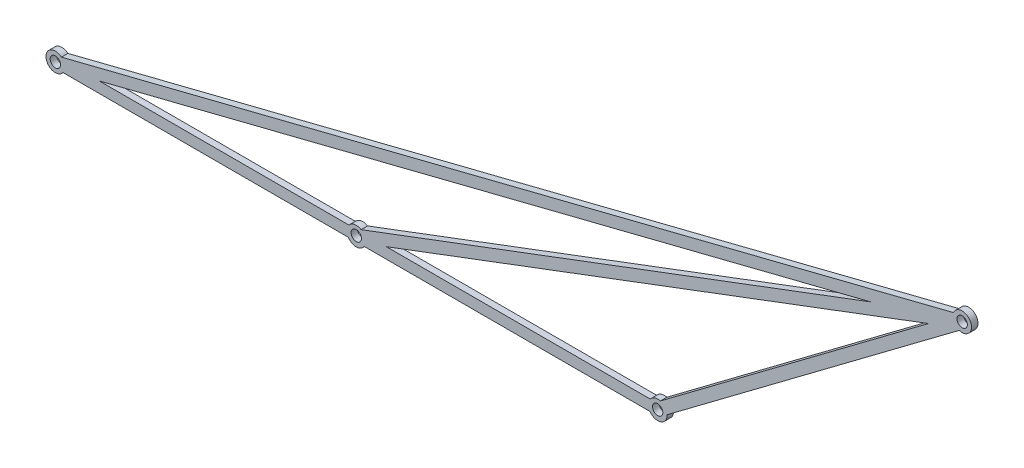
ISO-10303-21;
HEADER;
FILE_DESCRIPTION(('STEP AP214'),'2;1');
FILE_NAME('part.step','',(''),(''),'','','');
FILE_SCHEMA(('AUTOMOTIVE_DESIGN { 1 0 10303 214 1 1 1 1 }'));
ENDSEC;
DATA;
#1=APPLICATION_CONTEXT('core data for automotive mechanical design processes');
#2=APPLICATION_PROTOCOL_DEFINITION('international standard','automotive_design',2000,#1);
#3=PRODUCT_CONTEXT('',#1,'mechanical');
#4=PRODUCT('Part','Part','',(#3));
#5=PRODUCT_RELATED_PRODUCT_CATEGORY('part','',(#4));
#6=PRODUCT_DEFINITION_FORMATION('','',#4);
#7=PRODUCT_DEFINITION_CONTEXT('part definition',#1,'design');
#8=PRODUCT_DEFINITION('design','',#6,#7);
#9=PRODUCT_DEFINITION_SHAPE('','',#8);
#10=(LENGTH_UNIT() NAMED_UNIT(*) SI_UNIT(.MILLI.,.METRE.));
#11=(NAMED_UNIT(*) PLANE_ANGLE_UNIT() SI_UNIT($,.RADIAN.));
#12=(NAMED_UNIT(*) SI_UNIT($,.STERADIAN.) SOLID_ANGLE_UNIT());
#13=UNCERTAINTY_MEASURE_WITH_UNIT(LENGTH_MEASURE(1.E-05),#10,'distance_accuracy_value','');
#14=(GEOMETRIC_REPRESENTATION_CONTEXT(3) GLOBAL_UNCERTAINTY_ASSIGNED_CONTEXT((#13)) GLOBAL_UNIT_ASSIGNED_CONTEXT((#10,
#11,#12)) REPRESENTATION_CONTEXT('',''));
#15=CARTESIAN_POINT('',(0.,0.,0.));
#16=DIRECTION('',(0.,0.,1.));
#17=DIRECTION('',(1.,0.,0.));
#18=AXIS2_PLACEMENT_3D('',#15,#16,#17);
#19=CARTESIAN_POINT('',(399.72304446573,299.748851909776,8.5));
#20=DIRECTION('',(0.,0.,-1.));
#21=DIRECTION('',(-1.,0.,0.));
#22=AXIS2_PLACEMENT_3D('',#19,#20,#21);
#23=CYLINDRICAL_SURFACE('',#22,12.2928402072178);
#24=CARTESIAN_POINT('',(399.72304446573,299.748851909776,0.));
#25=DIRECTION('',(0.,0.,1.));
#26=DIRECTION('',(1.,0.,0.));
#27=AXIS2_PLACEMENT_3D('',#24,#25,#26);
#28=CIRCLE('',#27,12.2928402072178);
#29=CARTESIAN_POINT('',(395.972037606743,288.042278205057,0.));
#30=VERTEX_POINT('',#29);
#31=CARTESIAN_POINT('',(388.360524277615,304.440019710533,0.));
#32=VERTEX_POINT('',#31);
#33=EDGE_CURVE('E612',#30,#32,#28,.T.);
#34=ORIENTED_EDGE('',*,*,#33,.T.);
#35=DIRECTION('',(0.,0.,-1.));
#36=VECTOR('',#35,1.);
#37=CARTESIAN_POINT('',(388.360524277615,304.440019710533,8.5));
#38=LINE('',#37,#36);
#39=CARTESIAN_POINT('',(388.360524277615,304.440019710533,8.5));
#40=VERTEX_POINT('',#39);
#41=EDGE_CURVE('E427',#40,#32,#38,.T.);
#42=ORIENTED_EDGE('',*,*,#41,.F.);
#43=CARTESIAN_POINT('',(399.72304446573,299.748851909776,8.5));
#44=DIRECTION('',(0.,0.,1.));
#45=DIRECTION('',(1.,0.,0.));
#46=AXIS2_PLACEMENT_3D('',#43,#44,#45);
#47=CIRCLE('',#46,12.2928402072178);
#48=CARTESIAN_POINT('',(395.972037606743,288.042278205057,8.5));
#49=VERTEX_POINT('',#48);
#50=EDGE_CURVE('E667',#49,#40,#47,.T.);
#51=ORIENTED_EDGE('',*,*,#50,.F.);
#52=DIRECTION('',(0.,0.,-1.));
#53=VECTOR('',#52,1.);
#54=CARTESIAN_POINT('',(395.972037606743,288.042278205057,8.5));
#55=LINE('',#54,#53);
#56=EDGE_CURVE('E12',#49,#30,#55,.T.);
#57=ORIENTED_EDGE('',*,*,#56,.T.);
#58=EDGE_LOOP('',(#34,#42,#51,#57));
#59=FACE_BOUND('',#58,.T.);
#60=ADVANCED_FACE('F417',(#59),#23,.T.);
#61=CARTESIAN_POINT('',(0.,0.,0.));
#62=DIRECTION('',(0.,0.,1.));
#63=DIRECTION('',(1.,0.,0.));
#64=AXIS2_PLACEMENT_3D('',#61,#62,#63);
#65=PLANE('',#64);
#66=CARTESIAN_POINT('',(399.72304446573,299.748851909776,0.));
#67=DIRECTION('',(0.,0.,1.));
#68=DIRECTION('',(1.,0.,0.));
#69=AXIS2_PLACEMENT_3D('',#66,#67,#68);
#70=CIRCLE('',#69,6.81500000000003);
#71=CARTESIAN_POINT('',(406.53804446573,299.748851909776,0.));
#72=VERTEX_POINT('',#71);
#73=EDGE_CURVE('E581',#72,#72,#70,.T.);
#74=ORIENTED_EDGE('',*,*,#73,.T.);
#75=EDGE_LOOP('',(#74));
#76=FACE_BOUND('',#75,.T.);
#77=CARTESIAN_POINT('',(-395.609498980774,0.,0.));
#78=DIRECTION('',(0.,0.,1.));
#79=DIRECTION('',(1.,0.,0.));
#80=AXIS2_PLACEMENT_3D('',#77,#78,#79);
#81=CIRCLE('',#80,6.81500000000003);
#82=CARTESIAN_POINT('',(-388.794498980774,0.,0.));
#83=VERTEX_POINT('',#82);
#84=EDGE_CURVE('E683',#83,#83,#81,.T.);
#85=ORIENTED_EDGE('',*,*,#84,.T.);
#86=EDGE_LOOP('',(#85));
#87=FACE_BOUND('',#86,.T.);
#88=CARTESIAN_POINT('',(0.,0.,0.));
#89=DIRECTION('',(0.,0.,1.));
#90=DIRECTION('',(1.,0.,0.));
#91=AXIS2_PLACEMENT_3D('',#88,#89,#90);
#92=CIRCLE('',#91,6.815);
#93=CARTESIAN_POINT('',(6.815,0.,0.));
#94=VERTEX_POINT('',#93);
#95=EDGE_CURVE('E677',#94,#94,#92,.T.);
#96=ORIENTED_EDGE('',*,*,#95,.T.);
#97=EDGE_LOOP('',(#96));
#98=FACE_BOUND('',#97,.T.);
#99=CARTESIAN_POINT('',(-790.597372058686,-1.45230381165897E-13,0.));
#100=DIRECTION('',(0.,0.,1.));
#101=DIRECTION('',(1.,0.,0.));
#102=AXIS2_PLACEMENT_3D('',#99,#100,#101);
#103=CIRCLE('',#102,6.81500000000003);
#104=CARTESIAN_POINT('',(-783.782372058686,-1.45230381165897E-13,0.));
#105=VERTEX_POINT('',#104);
#106=EDGE_CURVE('E671',#105,#105,#103,.T.);
#107=ORIENTED_EDGE('',*,*,#106,.T.);
#108=EDGE_LOOP('',(#107));
#109=FACE_BOUND('',#108,.T.);
#110=DIRECTION('',(0.8,0.6,0.));
#111=VECTOR('',#110,1.);
#112=CARTESIAN_POINT('',(4.28963999999937,-5.71952000000044,0.));
#113=LINE('',#112,#111);
#114=CARTESIAN_POINT('',(12.4331257799266,0.388094334944971,0.));
#115=VERTEX_POINT('',#114);
#116=EDGE_CURVE('E564',#115,#30,#113,.T.);
#117=ORIENTED_EDGE('',*,*,#116,.F.);
#118=CARTESIAN_POINT('',(0.156250041431716,-0.238198297733638,0.));
#119=DIRECTION('',(0.,0.,1.));
#120=DIRECTION('',(1.,0.,0.));
#121=AXIS2_PLACEMENT_3D('',#118,#119,#120);
#122=CIRCLE('',#121,12.2928402072178);
#123=CARTESIAN_POINT('',(-10.0098313762425,-7.14940000000005,0.));
#124=VERTEX_POINT('',#123);
#125=EDGE_CURVE('E577',#124,#115,#122,.T.);
#126=ORIENTED_EDGE('',*,*,#125,.F.);
#127=DIRECTION('',(-1.,0.,0.));
#128=VECTOR('',#127,1.);
#129=CARTESIAN_POINT('',(0.,-7.14940000000005,0.));
#130=LINE('',#129,#128);
#131=CARTESIAN_POINT('',(-385.280698127999,-7.14940000000001,0.));
#132=VERTEX_POINT('',#131);
#133=EDGE_CURVE('E629',#124,#132,#130,.T.);
#134=ORIENTED_EDGE('',*,*,#133,.T.);
#135=CARTESIAN_POINT('',(-395.672766052159,-0.582905911078374,0.));
#136=DIRECTION('',(0.,0.,1.));
#137=DIRECTION('',(1.,0.,0.));
#138=AXIS2_PLACEMENT_3D('',#135,#136,#137);
#139=CIRCLE('',#138,12.2928402072178);
#140=CARTESIAN_POINT('',(-406.064833976318,-7.1494,0.));
#141=VERTEX_POINT('',#140);
#142=EDGE_CURVE('E553',#141,#132,#139,.T.);
#143=ORIENTED_EDGE('',*,*,#142,.F.);
#144=CARTESIAN_POINT('',(-780.597372058677,-7.14939999999996,0.));
#145=VERTEX_POINT('',#144);
#146=EDGE_CURVE('E636',#141,#145,#130,.T.);
#147=ORIENTED_EDGE('',*,*,#146,.T.);
#148=CARTESIAN_POINT('',(-790.597372058686,-1.45230381165897E-13,0.));
#149=DIRECTION('',(0.,0.,1.));
#150=DIRECTION('',(1.,0.,0.));
#151=AXIS2_PLACEMENT_3D('',#148,#149,#150);
#152=CIRCLE('',#151,12.2928402072178);
#153=CARTESIAN_POINT('',(-782.647332163134,9.37607519270833,0.));
#154=VERTEX_POINT('',#153);
#155=EDGE_CURVE('E580',#154,#145,#152,.T.);
#156=ORIENTED_EDGE('',*,*,#155,.F.);
#157=DIRECTION('',(0.969690354066138,0.244337097533485,0.));
#158=VECTOR('',#157,1.);
#159=CARTESIAN_POINT('',(-782.647332163134,9.37607519270833,0.));
#160=LINE('',#159,#158);
#161=EDGE_CURVE('E606',#154,#32,#160,.T.);
#162=ORIENTED_EDGE('',*,*,#161,.T.);
#163=ORIENTED_EDGE('',*,*,#33,.F.);
#164=EDGE_LOOP('',(#117,#126,#134,#143,#147,#156,#162,#163));
#165=FACE_BOUND('',#164,.T.);
#166=CARTESIAN_POINT('',(3.52842507334304,11.5830688050073,0.));
#167=VERTEX_POINT('',#166);
#168=CARTESIAN_POINT('',(-9.66909024537339,7.14939999999995,0.));
#169=VERTEX_POINT('',#168);
#170=EDGE_CURVE('E575',#167,#169,#122,.T.);
#171=ORIENTED_EDGE('',*,*,#170,.F.);
#172=DIRECTION('',(0.8,0.6,0.));
#173=VECTOR('',#172,1.);
#174=CARTESIAN_POINT('',(-4.28964000000063,5.71951999999956,0.));
#175=LINE('',#174,#173);
#176=CARTESIAN_POINT('',(355.529405996581,275.583804497435,0.));
#177=VERTEX_POINT('',#176);
#178=EDGE_CURVE('E540',#167,#177,#175,.T.);
#179=ORIENTED_EDGE('',*,*,#178,.T.);
#180=DIRECTION('',(-0.935645512975698,-0.352941176470588,0.));
#181=VECTOR('',#180,1.);
#182=CARTESIAN_POINT('',(402.52331764706,293.310695969532,0.));
#183=LINE('',#182,#181);
#184=CARTESIAN_POINT('',(-356.089024609682,7.14940000000004,0.));
#185=VERTEX_POINT('',#184);
#186=EDGE_CURVE('E584',#177,#185,#183,.T.);
#187=ORIENTED_EDGE('',*,*,#186,.T.);
#188=DIRECTION('',(-1.,0.,0.));
#189=VECTOR('',#188,1.);
#190=CARTESIAN_POINT('',(0.,7.14939999999994,0.));
#191=LINE('',#190,#189);
#192=EDGE_CURVE('E635',#169,#185,#191,.T.);
#193=ORIENTED_EDGE('',*,*,#192,.F.);
#194=EDGE_LOOP('',(#171,#179,#187,#193));
#195=FACE_BOUND('',#194,.T.);
#196=CARTESIAN_POINT('',(-389.274490600557,9.91356928803593,0.));
#197=VERTEX_POINT('',#196);
#198=CARTESIAN_POINT('',(-405.229196644053,7.14939999999999,0.));
#199=VERTEX_POINT('',#198);
#200=EDGE_CURVE('E572',#197,#199,#139,.T.);
#201=ORIENTED_EDGE('',*,*,#200,.F.);
#202=DIRECTION('',(-0.935645512975698,-0.352941176470588,0.));
#203=VECTOR('',#202,1.);
#204=CARTESIAN_POINT('',(397.476682352942,306.689304030469,0.));
#205=LINE('',#204,#203);
#206=CARTESIAN_POINT('',(280.120400530507,262.420546687856,0.));
#207=VERTEX_POINT('',#206);
#208=EDGE_CURVE('E640',#207,#197,#205,.T.);
#209=ORIENTED_EDGE('',*,*,#208,.F.);
#210=DIRECTION('',(0.969690354066138,0.244337097533485,0.));
#211=VECTOR('',#210,1.);
#212=CARTESIAN_POINT('',(-779.153604872923,-4.48933324201257,0.));
#213=LINE('',#212,#211);
#214=CARTESIAN_POINT('',(-732.963454166145,7.14939999999995,0.));
#215=VERTEX_POINT('',#214);
#216=EDGE_CURVE('E623',#215,#207,#213,.T.);
#217=ORIENTED_EDGE('',*,*,#216,.F.);
#218=EDGE_CURVE('E588',#199,#215,#191,.T.);
#219=ORIENTED_EDGE('',*,*,#218,.F.);
#220=EDGE_LOOP('',(#201,#209,#217,#219));
#221=FACE_BOUND('',#220,.T.);
#222=ADVANCED_FACE('F653',(#76,#87,#98,#109,#165,#195,#221),#65,.F.);
#223=CARTESIAN_POINT('',(0.,0.,8.5));
#224=DIRECTION('',(0.,0.,1.));
#225=DIRECTION('',(1.,0.,0.));
#226=AXIS2_PLACEMENT_3D('',#223,#224,#225);
#227=PLANE('',#226);
#228=CARTESIAN_POINT('',(399.72304446573,299.748851909776,8.5));
#229=DIRECTION('',(0.,0.,1.));
#230=DIRECTION('',(1.,0.,0.));
#231=AXIS2_PLACEMENT_3D('',#228,#229,#230);
#232=CIRCLE('',#231,6.81500000000003);
#233=CARTESIAN_POINT('',(406.53804446573,299.748851909776,8.5));
#234=VERTEX_POINT('',#233);
#235=EDGE_CURVE('E689',#234,#234,#232,.T.);
#236=ORIENTED_EDGE('',*,*,#235,.F.);
#237=EDGE_LOOP('',(#236));
#238=FACE_BOUND('',#237,.T.);
#239=CARTESIAN_POINT('',(-395.609498980774,0.,8.5));
#240=DIRECTION('',(0.,0.,1.));
#241=DIRECTION('',(1.,0.,0.));
#242=AXIS2_PLACEMENT_3D('',#239,#240,#241);
#243=CIRCLE('',#242,6.81500000000003);
#244=CARTESIAN_POINT('',(-388.794498980774,0.,8.5));
#245=VERTEX_POINT('',#244);
#246=EDGE_CURVE('E686',#245,#245,#243,.T.);
#247=ORIENTED_EDGE('',*,*,#246,.F.);
#248=EDGE_LOOP('',(#247));
#249=FACE_BOUND('',#248,.T.);
#250=CARTESIAN_POINT('',(0.,0.,8.5));
#251=DIRECTION('',(0.,0.,1.));
#252=DIRECTION('',(1.,0.,0.));
#253=AXIS2_PLACEMENT_3D('',#250,#251,#252);
#254=CIRCLE('',#253,6.815);
#255=CARTESIAN_POINT('',(6.815,0.,8.5));
#256=VERTEX_POINT('',#255);
#257=EDGE_CURVE('E680',#256,#256,#254,.T.);
#258=ORIENTED_EDGE('',*,*,#257,.F.);
#259=EDGE_LOOP('',(#258));
#260=FACE_BOUND('',#259,.T.);
#261=CARTESIAN_POINT('',(-790.597372058686,-1.45230381165897E-13,8.5));
#262=DIRECTION('',(0.,0.,1.));
#263=DIRECTION('',(1.,0.,0.));
#264=AXIS2_PLACEMENT_3D('',#261,#262,#263);
#265=CIRCLE('',#264,6.81500000000003);
#266=CARTESIAN_POINT('',(-783.782372058686,-1.45230381165897E-13,8.5));
#267=VERTEX_POINT('',#266);
#268=EDGE_CURVE('E674',#267,#267,#265,.T.);
#269=ORIENTED_EDGE('',*,*,#268,.F.);
#270=EDGE_LOOP('',(#269));
#271=FACE_BOUND('',#270,.T.);
#272=CARTESIAN_POINT('',(0.156250041431716,-0.238198297733638,8.5));
#273=DIRECTION('',(0.,0.,1.));
#274=DIRECTION('',(1.,0.,0.));
#275=AXIS2_PLACEMENT_3D('',#272,#273,#274);
#276=CIRCLE('',#275,12.2928402072178);
#277=CARTESIAN_POINT('',(-10.0098313762425,-7.14940000000005,8.5));
#278=VERTEX_POINT('',#277);
#279=CARTESIAN_POINT('',(12.4331257799266,0.388094334944971,8.5));
#280=VERTEX_POINT('',#279);
#281=EDGE_CURVE('E527',#278,#280,#276,.T.);
#282=ORIENTED_EDGE('',*,*,#281,.T.);
#283=DIRECTION('',(0.8,0.6,0.));
#284=VECTOR('',#283,1.);
#285=CARTESIAN_POINT('',(4.28963999999937,-5.71952000000044,8.5));
#286=LINE('',#285,#284);
#287=EDGE_CURVE('E559',#280,#49,#286,.T.);
#288=ORIENTED_EDGE('',*,*,#287,.T.);
#289=ORIENTED_EDGE('',*,*,#50,.T.);
#290=DIRECTION('',(0.969690354066138,0.244337097533485,0.));
#291=VECTOR('',#290,1.);
#292=CARTESIAN_POINT('',(-782.647332163134,9.37607519270833,8.5));
#293=LINE('',#292,#291);
#294=CARTESIAN_POINT('',(-782.647332163134,9.37607519270833,8.5));
#295=VERTEX_POINT('',#294);
#296=EDGE_CURVE('E619',#295,#40,#293,.T.);
#297=ORIENTED_EDGE('',*,*,#296,.F.);
#298=CARTESIAN_POINT('',(-790.597372058686,-1.45230381165897E-13,8.5));
#299=DIRECTION('',(0.,0.,1.));
#300=DIRECTION('',(1.,0.,0.));
#301=AXIS2_PLACEMENT_3D('',#298,#299,#300);
#302=CIRCLE('',#301,12.2928402072178);
#303=CARTESIAN_POINT('',(-780.597372058677,-7.14939999999996,8.5));
#304=VERTEX_POINT('',#303);
#305=EDGE_CURVE('E578',#295,#304,#302,.T.);
#306=ORIENTED_EDGE('',*,*,#305,.T.);
#307=DIRECTION('',(-1.,0.,0.));
#308=VECTOR('',#307,1.);
#309=CARTESIAN_POINT('',(0.,-7.14940000000005,8.5));
#310=LINE('',#309,#308);
#311=CARTESIAN_POINT('',(-406.064833976318,-7.1494,8.5));
#312=VERTEX_POINT('',#311);
#313=EDGE_CURVE('E630',#312,#304,#310,.T.);
#314=ORIENTED_EDGE('',*,*,#313,.F.);
#315=CARTESIAN_POINT('',(-395.672766052159,-0.582905911078374,8.5));
#316=DIRECTION('',(0.,0.,1.));
#317=DIRECTION('',(1.,0.,0.));
#318=AXIS2_PLACEMENT_3D('',#315,#316,#317);
#319=CIRCLE('',#318,12.2928402072178);
#320=CARTESIAN_POINT('',(-385.280698127999,-7.14940000000001,8.5));
#321=VERTEX_POINT('',#320);
#322=EDGE_CURVE('E571',#312,#321,#319,.T.);
#323=ORIENTED_EDGE('',*,*,#322,.T.);
#324=EDGE_CURVE('E596',#278,#321,#310,.T.);
#325=ORIENTED_EDGE('',*,*,#324,.F.);
#326=EDGE_LOOP('',(#282,#288,#289,#297,#306,#314,#323,#325));
#327=FACE_BOUND('',#326,.T.);
#328=DIRECTION('',(0.8,0.6,0.));
#329=VECTOR('',#328,1.);
#330=CARTESIAN_POINT('',(-4.28964000000063,5.71951999999956,8.5));
#331=LINE('',#330,#329);
#332=CARTESIAN_POINT('',(3.52842507334304,11.5830688050073,8.5));
#333=VERTEX_POINT('',#332);
#334=CARTESIAN_POINT('',(355.529405996581,275.583804497435,8.5));
#335=VERTEX_POINT('',#334);
#336=EDGE_CURVE('E537',#333,#335,#331,.T.);
#337=ORIENTED_EDGE('',*,*,#336,.F.);
#338=CARTESIAN_POINT('',(-9.66909024537339,7.14939999999995,8.5));
#339=VERTEX_POINT('',#338);
#340=EDGE_CURVE('E547',#333,#339,#276,.T.);
#341=ORIENTED_EDGE('',*,*,#340,.T.);
#342=DIRECTION('',(-1.,0.,0.));
#343=VECTOR('',#342,1.);
#344=CARTESIAN_POINT('',(0.,7.14939999999994,8.5));
#345=LINE('',#344,#343);
#346=CARTESIAN_POINT('',(-356.089024609682,7.14940000000004,8.5));
#347=VERTEX_POINT('',#346);
#348=EDGE_CURVE('E628',#339,#347,#345,.T.);
#349=ORIENTED_EDGE('',*,*,#348,.T.);
#350=DIRECTION('',(-0.935645512975698,-0.352941176470588,0.));
#351=VECTOR('',#350,1.);
#352=CARTESIAN_POINT('',(402.52331764706,293.310695969532,8.5));
#353=LINE('',#352,#351);
#354=EDGE_CURVE('E558',#335,#347,#353,.T.);
#355=ORIENTED_EDGE('',*,*,#354,.F.);
#356=EDGE_LOOP('',(#337,#341,#349,#355));
#357=FACE_BOUND('',#356,.T.);
#358=DIRECTION('',(-0.935645512975698,-0.352941176470588,0.));
#359=VECTOR('',#358,1.);
#360=CARTESIAN_POINT('',(397.476682352942,306.689304030469,8.5));
#361=LINE('',#360,#359);
#362=CARTESIAN_POINT('',(280.120400530507,262.420546687856,8.5));
#363=VERTEX_POINT('',#362);
#364=CARTESIAN_POINT('',(-389.274490600557,9.91356928803593,8.5));
#365=VERTEX_POINT('',#364);
#366=EDGE_CURVE('E591',#363,#365,#361,.T.);
#367=ORIENTED_EDGE('',*,*,#366,.T.);
#368=CARTESIAN_POINT('',(-405.229196644053,7.14939999999999,8.5));
#369=VERTEX_POINT('',#368);
#370=EDGE_CURVE('E567',#365,#369,#319,.T.);
#371=ORIENTED_EDGE('',*,*,#370,.T.);
#372=CARTESIAN_POINT('',(-732.963454166145,7.14939999999995,8.5));
#373=VERTEX_POINT('',#372);
#374=EDGE_CURVE('E625',#369,#373,#345,.T.);
#375=ORIENTED_EDGE('',*,*,#374,.T.);
#376=DIRECTION('',(0.969690354066138,0.244337097533485,0.));
#377=VECTOR('',#376,1.);
#378=CARTESIAN_POINT('',(-779.153604872923,-4.48933324201257,8.5));
#379=LINE('',#378,#377);
#380=EDGE_CURVE('E613',#373,#363,#379,.T.);
#381=ORIENTED_EDGE('',*,*,#380,.T.);
#382=EDGE_LOOP('',(#367,#371,#375,#381));
#383=FACE_BOUND('',#382,.T.);
#384=ADVANCED_FACE('F555',(#238,#249,#260,#271,#327,#357,#383),#227,.T.);
#385=CARTESIAN_POINT('',(-395.672766052159,-0.582905911078374,8.5));
#386=DIRECTION('',(0.,0.,-1.));
#387=DIRECTION('',(-1.,0.,0.));
#388=AXIS2_PLACEMENT_3D('',#385,#386,#387);
#389=CYLINDRICAL_SURFACE('',#388,12.2928402072178);
#390=DIRECTION('',(0.,0.,-1.));
#391=VECTOR('',#390,1.);
#392=CARTESIAN_POINT('',(-406.064833976318,-7.1494,8.5));
#393=LINE('',#392,#391);
#394=EDGE_CURVE('E598',#141,#312,#393,.F.);
#395=ORIENTED_EDGE('',*,*,#394,.F.);
#396=ORIENTED_EDGE('',*,*,#142,.T.);
#397=DIRECTION('',(0.,0.,-1.));
#398=VECTOR('',#397,1.);
#399=CARTESIAN_POINT('',(-385.280698127999,-7.14940000000001,8.5));
#400=LINE('',#399,#398);
#401=EDGE_CURVE('E595',#321,#132,#400,.T.);
#402=ORIENTED_EDGE('',*,*,#401,.F.);
#403=ORIENTED_EDGE('',*,*,#322,.F.);
#404=EDGE_LOOP('',(#395,#396,#402,#403));
#405=FACE_BOUND('',#404,.T.);
#406=ADVANCED_FACE('F706',(#405),#389,.T.);
#407=ORIENTED_EDGE('',*,*,#200,.T.);
#408=DIRECTION('',(0.,0.,-1.));
#409=VECTOR('',#408,1.);
#410=CARTESIAN_POINT('',(-405.229196644053,7.14939999999999,8.5));
#411=LINE('',#410,#409);
#412=EDGE_CURVE('E601',#199,#369,#411,.F.);
#413=ORIENTED_EDGE('',*,*,#412,.T.);
#414=ORIENTED_EDGE('',*,*,#370,.F.);
#415=DIRECTION('',(0.,0.,-1.));
#416=VECTOR('',#415,1.);
#417=CARTESIAN_POINT('',(-389.274490600557,9.91356928803593,8.5));
#418=LINE('',#417,#416);
#419=EDGE_CURVE('E585',#365,#197,#418,.T.);
#420=ORIENTED_EDGE('',*,*,#419,.T.);
#421=EDGE_LOOP('',(#407,#413,#414,#420));
#422=FACE_BOUND('',#421,.T.);
#423=ADVANCED_FACE('F651',(#422),#389,.T.);
#424=CARTESIAN_POINT('',(0.,7.14939999999994,8.5));
#425=DIRECTION('',(0.,-1.,0.));
#426=DIRECTION('',(1.,0.,0.));
#427=AXIS2_PLACEMENT_3D('',#424,#425,#426);
#428=PLANE('',#427);
#429=ORIENTED_EDGE('',*,*,#192,.T.);
#430=DIRECTION('',(0.,0.,1.));
#431=VECTOR('',#430,1.);
#432=CARTESIAN_POINT('',(-356.089024609683,7.14939999999999,8.5));
#433=LINE('',#432,#431);
#434=EDGE_CURVE('E605',#185,#347,#433,.T.);
#435=ORIENTED_EDGE('',*,*,#434,.T.);
#436=ORIENTED_EDGE('',*,*,#348,.F.);
#437=DIRECTION('',(0.,0.,-1.));
#438=VECTOR('',#437,1.);
#439=CARTESIAN_POINT('',(-9.66909024537339,7.14939999999995,8.5));
#440=LINE('',#439,#438);
#441=EDGE_CURVE('E549',#169,#339,#440,.F.);
#442=ORIENTED_EDGE('',*,*,#441,.F.);
#443=EDGE_LOOP('',(#429,#435,#436,#442));
#444=FACE_BOUND('',#443,.T.);
#445=ADVANCED_FACE('F744',(#444),#428,.F.);
#446=CARTESIAN_POINT('',(0.,-7.14940000000005,8.5));
#447=DIRECTION('',(0.,-1.,0.));
#448=DIRECTION('',(1.,0.,0.));
#449=AXIS2_PLACEMENT_3D('',#446,#447,#448);
#450=PLANE('',#449);
#451=ORIENTED_EDGE('',*,*,#133,.F.);
#452=DIRECTION('',(0.,0.,-1.));
#453=VECTOR('',#452,1.);
#454=CARTESIAN_POINT('',(-10.0098313762425,-7.14940000000005,8.5));
#455=LINE('',#454,#453);
#456=EDGE_CURVE('E600',#124,#278,#455,.F.);
#457=ORIENTED_EDGE('',*,*,#456,.T.);
#458=ORIENTED_EDGE('',*,*,#324,.T.);
#459=ORIENTED_EDGE('',*,*,#401,.T.);
#460=EDGE_LOOP('',(#451,#457,#458,#459));
#461=FACE_BOUND('',#460,.T.);
#462=ADVANCED_FACE('F740',(#461),#450,.T.);
#463=ORIENTED_EDGE('',*,*,#146,.F.);
#464=ORIENTED_EDGE('',*,*,#394,.T.);
#465=ORIENTED_EDGE('',*,*,#313,.T.);
#466=DIRECTION('',(0.,0.,-1.));
#467=VECTOR('',#466,1.);
#468=CARTESIAN_POINT('',(-780.597372058677,-7.14939999999996,8.5));
#469=LINE('',#468,#467);
#470=EDGE_CURVE('E592',#304,#145,#469,.T.);
#471=ORIENTED_EDGE('',*,*,#470,.T.);
#472=EDGE_LOOP('',(#463,#464,#465,#471));
#473=FACE_BOUND('',#472,.T.);
#474=ADVANCED_FACE('F743',(#473),#450,.T.);
#475=CARTESIAN_POINT('',(397.476682352942,306.689304030469,8.5));
#476=DIRECTION('',(0.352941176470588,-0.935645512975698,0.));
#477=DIRECTION('',(0.935645512975698,0.352941176470588,0.));
#478=AXIS2_PLACEMENT_3D('',#475,#476,#477);
#479=PLANE('',#478);
#480=ORIENTED_EDGE('',*,*,#366,.F.);
#481=DIRECTION('',(0.,0.,-1.));
#482=VECTOR('',#481,1.);
#483=CARTESIAN_POINT('',(280.120400530486,262.420546687849,8.5));
#484=LINE('',#483,#482);
#485=EDGE_CURVE('E607',#363,#207,#484,.T.);
#486=ORIENTED_EDGE('',*,*,#485,.T.);
#487=ORIENTED_EDGE('',*,*,#208,.T.);
#488=ORIENTED_EDGE('',*,*,#419,.F.);
#489=EDGE_LOOP('',(#480,#486,#487,#488));
#490=FACE_BOUND('',#489,.T.);
#491=ADVANCED_FACE('F644',(#490),#479,.F.);
#492=ORIENTED_EDGE('',*,*,#218,.T.);
#493=DIRECTION('',(0.,0.,1.));
#494=VECTOR('',#493,1.);
#495=CARTESIAN_POINT('',(-732.963454166144,7.14940000000003,8.5));
#496=LINE('',#495,#494);
#497=EDGE_CURVE('E421',#215,#373,#496,.T.);
#498=ORIENTED_EDGE('',*,*,#497,.T.);
#499=ORIENTED_EDGE('',*,*,#374,.F.);
#500=ORIENTED_EDGE('',*,*,#412,.F.);
#501=EDGE_LOOP('',(#492,#498,#499,#500));
#502=FACE_BOUND('',#501,.T.);
#503=ADVANCED_FACE('F655',(#502),#428,.F.);
#504=CARTESIAN_POINT('',(0.156250041431716,-0.238198297733638,8.5));
#505=DIRECTION('',(0.,0.,-1.));
#506=DIRECTION('',(-1.,0.,0.));
#507=AXIS2_PLACEMENT_3D('',#504,#505,#506);
#508=CYLINDRICAL_SURFACE('',#507,12.2928402072178);
#509=ORIENTED_EDGE('',*,*,#170,.T.);
#510=ORIENTED_EDGE('',*,*,#441,.T.);
#511=ORIENTED_EDGE('',*,*,#340,.F.);
#512=DIRECTION('',(0.,0.,-1.));
#513=VECTOR('',#512,1.);
#514=CARTESIAN_POINT('',(3.52842507334304,11.5830688050073,8.5));
#515=LINE('',#514,#513);
#516=EDGE_CURVE('E533',#167,#333,#515,.F.);
#517=ORIENTED_EDGE('',*,*,#516,.F.);
#518=EDGE_LOOP('',(#509,#510,#511,#517));
#519=FACE_BOUND('',#518,.T.);
#520=ADVANCED_FACE('F548',(#519),#508,.T.);
#521=CARTESIAN_POINT('',(402.52331764706,293.310695969532,8.5));
#522=DIRECTION('',(0.352941176470588,-0.935645512975698,0.));
#523=DIRECTION('',(0.935645512975698,0.352941176470588,0.));
#524=AXIS2_PLACEMENT_3D('',#521,#522,#523);
#525=PLANE('',#524);
#526=ORIENTED_EDGE('',*,*,#434,.F.);
#527=ORIENTED_EDGE('',*,*,#186,.F.);
#528=DIRECTION('',(0.,0.,-1.));
#529=VECTOR('',#528,1.);
#530=CARTESIAN_POINT('',(355.529405996578,275.583804497434,8.5));
#531=LINE('',#530,#529);
#532=EDGE_CURVE('E589',#335,#177,#531,.T.);
#533=ORIENTED_EDGE('',*,*,#532,.F.);
#534=ORIENTED_EDGE('',*,*,#354,.T.);
#535=EDGE_LOOP('',(#526,#527,#533,#534));
#536=FACE_BOUND('',#535,.T.);
#537=ADVANCED_FACE('F751',(#536),#525,.T.);
#538=ORIENTED_EDGE('',*,*,#456,.F.);
#539=ORIENTED_EDGE('',*,*,#125,.T.);
#540=DIRECTION('',(0.,0.,-1.));
#541=VECTOR('',#540,1.);
#542=CARTESIAN_POINT('',(12.4331257799266,0.388094334944972,8.5));
#543=LINE('',#542,#541);
#544=EDGE_CURVE('E544',#115,#280,#543,.F.);
#545=ORIENTED_EDGE('',*,*,#544,.T.);
#546=ORIENTED_EDGE('',*,*,#281,.F.);
#547=EDGE_LOOP('',(#538,#539,#545,#546));
#548=FACE_BOUND('',#547,.T.);
#549=ADVANCED_FACE('F754',(#548),#508,.T.);
#550=CARTESIAN_POINT('',(-790.597372058686,-1.45230381165897E-13,8.5));
#551=DIRECTION('',(0.,0.,-1.));
#552=DIRECTION('',(-1.,0.,0.));
#553=AXIS2_PLACEMENT_3D('',#550,#551,#552);
#554=CYLINDRICAL_SURFACE('',#553,12.2928402072178);
#555=DIRECTION('',(0.,0.,-1.));
#556=VECTOR('',#555,1.);
#557=CARTESIAN_POINT('',(-782.647332163134,9.37607519270833,8.5));
#558=LINE('',#557,#556);
#559=EDGE_CURVE('E608',#295,#154,#558,.T.);
#560=ORIENTED_EDGE('',*,*,#559,.T.);
#561=ORIENTED_EDGE('',*,*,#155,.T.);
#562=ORIENTED_EDGE('',*,*,#470,.F.);
#563=ORIENTED_EDGE('',*,*,#305,.F.);
#564=EDGE_LOOP('',(#560,#561,#562,#563));
#565=FACE_BOUND('',#564,.T.);
#566=ADVANCED_FACE('F419',(#565),#554,.T.);
#567=CARTESIAN_POINT('',(-4.28964000000063,5.71951999999956,8.5));
#568=DIRECTION('',(-0.6,0.8,0.));
#569=DIRECTION('',(-0.8,-0.6,0.));
#570=AXIS2_PLACEMENT_3D('',#567,#568,#569);
#571=PLANE('',#570);
#572=ORIENTED_EDGE('',*,*,#336,.T.);
#573=ORIENTED_EDGE('',*,*,#532,.T.);
#574=ORIENTED_EDGE('',*,*,#178,.F.);
#575=ORIENTED_EDGE('',*,*,#516,.T.);
#576=EDGE_LOOP('',(#572,#573,#574,#575));
#577=FACE_BOUND('',#576,.T.);
#578=ADVANCED_FACE('F535',(#577),#571,.T.);
#579=CARTESIAN_POINT('',(4.28963999999937,-5.71952000000044,8.5));
#580=DIRECTION('',(-0.6,0.8,0.));
#581=DIRECTION('',(-0.8,-0.6,0.));
#582=AXIS2_PLACEMENT_3D('',#579,#580,#581);
#583=PLANE('',#582);
#584=ORIENTED_EDGE('',*,*,#116,.T.);
#585=ORIENTED_EDGE('',*,*,#56,.F.);
#586=ORIENTED_EDGE('',*,*,#287,.F.);
#587=ORIENTED_EDGE('',*,*,#544,.F.);
#588=EDGE_LOOP('',(#584,#585,#586,#587));
#589=FACE_BOUND('',#588,.T.);
#590=ADVANCED_FACE('F738',(#589),#583,.F.);
#591=CARTESIAN_POINT('',(-782.647332163134,9.37607519270833,8.5));
#592=DIRECTION('',(-0.244337097533485,0.969690354066138,0.));
#593=DIRECTION('',(-0.969690354066138,-0.244337097533485,0.));
#594=AXIS2_PLACEMENT_3D('',#591,#592,#593);
#595=PLANE('',#594);
#596=ORIENTED_EDGE('',*,*,#296,.T.);
#597=ORIENTED_EDGE('',*,*,#41,.T.);
#598=ORIENTED_EDGE('',*,*,#161,.F.);
#599=ORIENTED_EDGE('',*,*,#559,.F.);
#600=EDGE_LOOP('',(#596,#597,#598,#599));
#601=FACE_BOUND('',#600,.T.);
#602=ADVANCED_FACE('F725',(#601),#595,.T.);
#603=CARTESIAN_POINT('',(-779.153604872923,-4.48933324201257,8.5));
#604=DIRECTION('',(-0.244337097533485,0.969690354066138,0.));
#605=DIRECTION('',(-0.969690354066138,-0.244337097533485,0.));
#606=AXIS2_PLACEMENT_3D('',#603,#604,#605);
#607=PLANE('',#606);
#608=ORIENTED_EDGE('',*,*,#497,.F.);
#609=ORIENTED_EDGE('',*,*,#216,.T.);
#610=ORIENTED_EDGE('',*,*,#485,.F.);
#611=ORIENTED_EDGE('',*,*,#380,.F.);
#612=EDGE_LOOP('',(#608,#609,#610,#611));
#613=FACE_BOUND('',#612,.T.);
#614=ADVANCED_FACE('F659',(#613),#607,.F.);
#615=CARTESIAN_POINT('',(-790.597372058686,-1.45230381165897E-13,0.));
#616=DIRECTION('',(0.,0.,1.));
#617=DIRECTION('',(1.,0.,0.));
#618=AXIS2_PLACEMENT_3D('',#615,#616,#617);
#619=CYLINDRICAL_SURFACE('',#618,6.81500000000003);
#620=ORIENTED_EDGE('',*,*,#106,.F.);
#621=EDGE_LOOP('',(#620));
#622=FACE_BOUND('',#621,.T.);
#623=ORIENTED_EDGE('',*,*,#268,.T.);
#624=EDGE_LOOP('',(#623));
#625=FACE_BOUND('',#624,.T.);
#626=ADVANCED_FACE('F714',(#622,#625),#619,.F.);
#627=CARTESIAN_POINT('',(0.,0.,0.));
#628=DIRECTION('',(0.,0.,1.));
#629=DIRECTION('',(1.,0.,0.));
#630=AXIS2_PLACEMENT_3D('',#627,#628,#629);
#631=CYLINDRICAL_SURFACE('',#630,6.815);
#632=ORIENTED_EDGE('',*,*,#95,.F.);
#633=EDGE_LOOP('',(#632));
#634=FACE_BOUND('',#633,.T.);
#635=ORIENTED_EDGE('',*,*,#257,.T.);
#636=EDGE_LOOP('',(#635));
#637=FACE_BOUND('',#636,.T.);
#638=ADVANCED_FACE('F716',(#634,#637),#631,.F.);
#639=CARTESIAN_POINT('',(-395.609498980774,0.,0.));
#640=DIRECTION('',(0.,0.,1.));
#641=DIRECTION('',(1.,0.,0.));
#642=AXIS2_PLACEMENT_3D('',#639,#640,#641);
#643=CYLINDRICAL_SURFACE('',#642,6.81500000000003);
#644=ORIENTED_EDGE('',*,*,#84,.F.);
#645=EDGE_LOOP('',(#644));
#646=FACE_BOUND('',#645,.T.);
#647=ORIENTED_EDGE('',*,*,#246,.T.);
#648=EDGE_LOOP('',(#647));
#649=FACE_BOUND('',#648,.T.);
#650=ADVANCED_FACE('F700',(#646,#649),#643,.F.);
#651=CARTESIAN_POINT('',(399.72304446573,299.748851909776,0.));
#652=DIRECTION('',(0.,0.,1.));
#653=DIRECTION('',(1.,0.,0.));
#654=AXIS2_PLACEMENT_3D('',#651,#652,#653);
#655=CYLINDRICAL_SURFACE('',#654,6.81500000000003);
#656=ORIENTED_EDGE('',*,*,#73,.F.);
#657=EDGE_LOOP('',(#656));
#658=FACE_BOUND('',#657,.T.);
#659=ORIENTED_EDGE('',*,*,#235,.T.);
#660=EDGE_LOOP('',(#659));
#661=FACE_BOUND('',#660,.T.);
#662=ADVANCED_FACE('F697',(#658,#661),#655,.F.);
#663=CLOSED_SHELL('',(#60,#222,#384,#406,#423,#445,#462,#474,#491,#503,#520,#537,#549,#566,#578,
#590,#602,#614,#626,#638,#650,#662));
#664=MANIFOLD_SOLID_BREP('B2',#663);
#665=ADVANCED_BREP_SHAPE_REPRESENTATION('',(#18,#664),#14);
#666=SHAPE_DEFINITION_REPRESENTATION(#9,#665);
ENDSEC;
END-ISO-10303-21;
